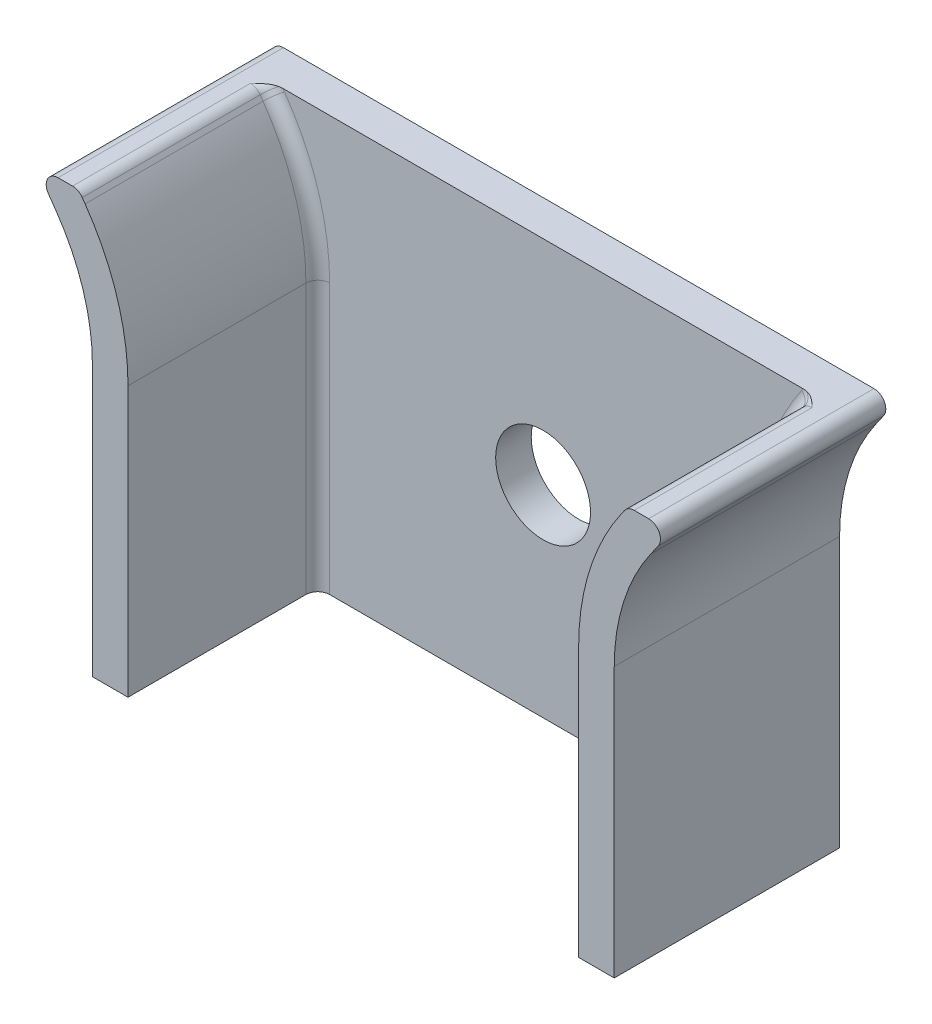
ISO-10303-21;
HEADER;
FILE_DESCRIPTION(('STEP AP214'),'2;1');
FILE_NAME('part.step','',(''),(''),'','','');
FILE_SCHEMA(('AUTOMOTIVE_DESIGN { 1 0 10303 214 1 1 1 1 }'));
ENDSEC;
DATA;
#1=APPLICATION_CONTEXT('core data for automotive mechanical design processes');
#2=APPLICATION_PROTOCOL_DEFINITION('international standard','automotive_design',2000,#1);
#3=PRODUCT_CONTEXT('',#1,'mechanical');
#4=PRODUCT('Part','Part','',(#3));
#5=PRODUCT_RELATED_PRODUCT_CATEGORY('part','',(#4));
#6=PRODUCT_DEFINITION_FORMATION('','',#4);
#7=PRODUCT_DEFINITION_CONTEXT('part definition',#1,'design');
#8=PRODUCT_DEFINITION('design','',#6,#7);
#9=PRODUCT_DEFINITION_SHAPE('','',#8);
#10=(LENGTH_UNIT() NAMED_UNIT(*) SI_UNIT(.MILLI.,.METRE.));
#11=(NAMED_UNIT(*) PLANE_ANGLE_UNIT() SI_UNIT($,.RADIAN.));
#12=(NAMED_UNIT(*) SI_UNIT($,.STERADIAN.) SOLID_ANGLE_UNIT());
#13=UNCERTAINTY_MEASURE_WITH_UNIT(LENGTH_MEASURE(1.E-05),#10,'distance_accuracy_value','');
#14=(GEOMETRIC_REPRESENTATION_CONTEXT(3) GLOBAL_UNCERTAINTY_ASSIGNED_CONTEXT((#13)) GLOBAL_UNIT_ASSIGNED_CONTEXT((#10,
#11,#12)) REPRESENTATION_CONTEXT('',''));
#15=CARTESIAN_POINT('',(0.,0.,0.));
#16=DIRECTION('',(0.,0.,1.));
#17=DIRECTION('',(1.,0.,0.));
#18=AXIS2_PLACEMENT_3D('',#15,#16,#17);
#19=CARTESIAN_POINT('',(0.,0.,3.));
#20=DIRECTION('',(0.,0.,1.));
#21=DIRECTION('',(1.,0.,0.));
#22=AXIS2_PLACEMENT_3D('',#19,#20,#21);
#23=PLANE('',#22);
#24=CARTESIAN_POINT('',(0.,17.0000000000001,3.));
#25=DIRECTION('',(0.,0.,1.));
#26=DIRECTION('',(1.,0.,0.));
#27=AXIS2_PLACEMENT_3D('',#24,#25,#26);
#28=CIRCLE('',#27,4.);
#29=CARTESIAN_POINT('',(4.,17.0000000000001,3.));
#30=VERTEX_POINT('',#29);
#31=EDGE_CURVE('E238',#30,#30,#28,.F.);
#32=ORIENTED_EDGE('',*,*,#31,.T.);
#33=EDGE_LOOP('',(#32));
#34=FACE_BOUND('',#33,.T.);
#35=CARTESIAN_POINT('',(39.,22.74812786,3.));
#36=DIRECTION('',(0.,0.,1.));
#37=DIRECTION('',(1.,0.,0.));
#38=AXIS2_PLACEMENT_3D('',#35,#36,#37);
#39=CIRCLE('',#38,21.);
#40=CARTESIAN_POINT('',(18.,22.74812786,3.));
#41=VERTEX_POINT('',#40);
#42=CARTESIAN_POINT('',(21.7978070794784,34.7932330370068,3.));
#43=VERTEX_POINT('',#42);
#44=EDGE_CURVE('E371',#41,#43,#39,.F.);
#45=ORIENTED_EDGE('',*,*,#44,.T.);
#46=DIRECTION('',(-0.573576437000323,-0.819152043834363,0.));
#47=VECTOR('',#46,1.);
#48=CARTESIAN_POINT('',(-1.72092410425407,1.20500403251831,3.));
#49=LINE('',#48,#47);
#50=CARTESIAN_POINT('',(21.9360536837472,34.990669648999,3.));
#51=VERTEX_POINT('',#50);
#52=EDGE_CURVE('E373',#43,#51,#49,.F.);
#53=ORIENTED_EDGE('',*,*,#52,.T.);
#54=DIRECTION('',(1.,0.,0.));
#55=VECTOR('',#54,1.);
#56=CARTESIAN_POINT('',(0.,34.990669648999,3.));
#57=LINE('',#56,#55);
#58=CARTESIAN_POINT('',(-21.9360536837471,34.990669648999,3.));
#59=VERTEX_POINT('',#58);
#60=EDGE_CURVE('E290',#59,#51,#57,.T.);
#61=ORIENTED_EDGE('',*,*,#60,.F.);
#62=DIRECTION('',(0.573576437000323,-0.819152043834363,0.));
#63=VECTOR('',#62,1.);
#64=CARTESIAN_POINT('',(-21.7978070794784,34.7932330370068,3.));
#65=LINE('',#64,#63);
#66=CARTESIAN_POINT('',(-21.7978070794784,34.7932330370068,3.));
#67=VERTEX_POINT('',#66);
#68=EDGE_CURVE('E367',#59,#67,#65,.T.);
#69=ORIENTED_EDGE('',*,*,#68,.T.);
#70=CARTESIAN_POINT('',(-39.,22.74812786,3.));
#71=DIRECTION('',(0.,0.,1.));
#72=DIRECTION('',(1.,0.,0.));
#73=AXIS2_PLACEMENT_3D('',#70,#71,#72);
#74=CIRCLE('',#73,21.);
#75=CARTESIAN_POINT('',(-18.,22.74812786,3.));
#76=VERTEX_POINT('',#75);
#77=EDGE_CURVE('E365',#67,#76,#74,.F.);
#78=ORIENTED_EDGE('',*,*,#77,.T.);
#79=DIRECTION('',(0.,-1.,0.));
#80=VECTOR('',#79,1.);
#81=CARTESIAN_POINT('',(-18.,0.,3.));
#82=LINE('',#81,#80);
#83=CARTESIAN_POINT('',(-18.,0.,3.));
#84=VERTEX_POINT('',#83);
#85=EDGE_CURVE('E363',#76,#84,#82,.T.);
#86=ORIENTED_EDGE('',*,*,#85,.T.);
#87=DIRECTION('',(1.,0.,0.));
#88=VECTOR('',#87,1.);
#89=CARTESIAN_POINT('',(0.,0.,3.));
#90=LINE('',#89,#88);
#91=CARTESIAN_POINT('',(18.,0.,3.));
#92=VERTEX_POINT('',#91);
#93=EDGE_CURVE('E287',#84,#92,#90,.T.);
#94=ORIENTED_EDGE('',*,*,#93,.T.);
#95=DIRECTION('',(0.,-1.,0.));
#96=VECTOR('',#95,1.);
#97=CARTESIAN_POINT('',(18.,0.,3.));
#98=LINE('',#97,#96);
#99=EDGE_CURVE('E369',#92,#41,#98,.F.);
#100=ORIENTED_EDGE('',*,*,#99,.T.);
#101=EDGE_LOOP('',(#45,#53,#61,#69,#78,#86,#94,#100));
#102=FACE_BOUND('',#101,.T.);
#103=ADVANCED_FACE('F37',(#34,#102),#23,.T.);
#104=CARTESIAN_POINT('',(0.,0.,3.));
#105=DIRECTION('',(0.,1.,0.));
#106=DIRECTION('',(0.,0.,1.));
#107=AXIS2_PLACEMENT_3D('',#104,#105,#106);
#108=PLANE('',#107);
#109=DIRECTION('',(1.,0.,0.));
#110=VECTOR('',#109,1.);
#111=CARTESIAN_POINT('',(0.,0.,0.));
#112=LINE('',#111,#110);
#113=CARTESIAN_POINT('',(-22.,0.,0.));
#114=VERTEX_POINT('',#113);
#115=CARTESIAN_POINT('',(22.,0.,0.));
#116=VERTEX_POINT('',#115);
#117=EDGE_CURVE('E286',#114,#116,#112,.T.);
#118=ORIENTED_EDGE('',*,*,#117,.T.);
#119=DIRECTION('',(0.,0.,-1.));
#120=VECTOR('',#119,1.);
#121=CARTESIAN_POINT('',(22.,0.,3.));
#122=LINE('',#121,#120);
#123=CARTESIAN_POINT('',(22.,0.,19.));
#124=VERTEX_POINT('',#123);
#125=EDGE_CURVE('E325',#124,#116,#122,.T.);
#126=ORIENTED_EDGE('',*,*,#125,.F.);
#127=DIRECTION('',(1.,0.,0.));
#128=VECTOR('',#127,1.);
#129=CARTESIAN_POINT('',(0.,0.,19.));
#130=LINE('',#129,#128);
#131=CARTESIAN_POINT('',(19.,0.,19.));
#132=VERTEX_POINT('',#131);
#133=EDGE_CURVE('E225',#132,#124,#130,.T.);
#134=ORIENTED_EDGE('',*,*,#133,.F.);
#135=DIRECTION('',(0.,0.,-1.));
#136=VECTOR('',#135,1.);
#137=CARTESIAN_POINT('',(19.,0.,19.));
#138=LINE('',#137,#136);
#139=CARTESIAN_POINT('',(19.,0.,4.));
#140=VERTEX_POINT('',#139);
#141=EDGE_CURVE('E216',#132,#140,#138,.T.);
#142=ORIENTED_EDGE('',*,*,#141,.T.);
#143=CARTESIAN_POINT('',(18.,0.,4.));
#144=DIRECTION('',(0.,1.,0.));
#145=DIRECTION('',(0.,0.,1.));
#146=AXIS2_PLACEMENT_3D('',#143,#144,#145);
#147=CIRCLE('',#146,1.);
#148=EDGE_CURVE('E46',#140,#92,#147,.T.);
#149=ORIENTED_EDGE('',*,*,#148,.T.);
#150=ORIENTED_EDGE('',*,*,#93,.F.);
#151=CARTESIAN_POINT('',(-18.,0.,4.));
#152=DIRECTION('',(0.,1.,0.));
#153=DIRECTION('',(0.,0.,1.));
#154=AXIS2_PLACEMENT_3D('',#151,#152,#153);
#155=CIRCLE('',#154,1.);
#156=CARTESIAN_POINT('',(-19.,0.,4.));
#157=VERTEX_POINT('',#156);
#158=EDGE_CURVE('E11',#84,#157,#155,.T.);
#159=ORIENTED_EDGE('',*,*,#158,.T.);
#160=DIRECTION('',(0.,0.,-1.));
#161=VECTOR('',#160,1.);
#162=CARTESIAN_POINT('',(-19.,0.,19.));
#163=LINE('',#162,#161);
#164=CARTESIAN_POINT('',(-19.,0.,19.));
#165=VERTEX_POINT('',#164);
#166=EDGE_CURVE('E277',#165,#157,#163,.T.);
#167=ORIENTED_EDGE('',*,*,#166,.F.);
#168=DIRECTION('',(1.,0.,0.));
#169=VECTOR('',#168,1.);
#170=CARTESIAN_POINT('',(0.,0.,19.));
#171=LINE('',#170,#169);
#172=CARTESIAN_POINT('',(-22.,0.,19.));
#173=VERTEX_POINT('',#172);
#174=EDGE_CURVE('E275',#173,#165,#171,.T.);
#175=ORIENTED_EDGE('',*,*,#174,.F.);
#176=DIRECTION('',(0.,0.,-1.));
#177=VECTOR('',#176,1.);
#178=CARTESIAN_POINT('',(-22.,0.,3.));
#179=LINE('',#178,#177);
#180=EDGE_CURVE('E293',#173,#114,#179,.T.);
#181=ORIENTED_EDGE('',*,*,#180,.T.);
#182=EDGE_LOOP('',(#118,#126,#134,#142,#149,#150,#159,#167,#175,#181));
#183=FACE_BOUND('',#182,.T.);
#184=ADVANCED_FACE('F439',(#183),#108,.F.);
#185=CARTESIAN_POINT('',(22.,0.,3.));
#186=DIRECTION('',(1.,0.,0.));
#187=DIRECTION('',(0.,0.,-1.));
#188=AXIS2_PLACEMENT_3D('',#185,#186,#187);
#189=PLANE('',#188);
#190=DIRECTION('',(0.,-1.,0.));
#191=VECTOR('',#190,1.);
#192=CARTESIAN_POINT('',(22.,0.,0.));
#193=LINE('',#192,#191);
#194=CARTESIAN_POINT('',(22.,22.74812786,0.));
#195=VERTEX_POINT('',#194);
#196=EDGE_CURVE('E296',#195,#116,#193,.T.);
#197=ORIENTED_EDGE('',*,*,#196,.F.);
#198=DIRECTION('',(0.,0.,-1.));
#199=VECTOR('',#198,1.);
#200=CARTESIAN_POINT('',(22.,22.74812786,3.));
#201=LINE('',#200,#199);
#202=CARTESIAN_POINT('',(22.,22.74812786,19.));
#203=VERTEX_POINT('',#202);
#204=EDGE_CURVE('E323',#203,#195,#201,.T.);
#205=ORIENTED_EDGE('',*,*,#204,.F.);
#206=DIRECTION('',(0.,1.,0.));
#207=VECTOR('',#206,1.);
#208=CARTESIAN_POINT('',(22.,0.,19.));
#209=LINE('',#208,#207);
#210=EDGE_CURVE('E242',#124,#203,#209,.T.);
#211=ORIENTED_EDGE('',*,*,#210,.F.);
#212=ORIENTED_EDGE('',*,*,#125,.T.);
#213=EDGE_LOOP('',(#197,#205,#211,#212));
#214=FACE_BOUND('',#213,.T.);
#215=ADVANCED_FACE('F447',(#214),#189,.T.);
#216=CARTESIAN_POINT('',(39.,22.74812786,3.));
#217=DIRECTION('',(0.,0.,-1.));
#218=DIRECTION('',(-1.,0.,0.));
#219=AXIS2_PLACEMENT_3D('',#216,#217,#218);
#220=CYLINDRICAL_SURFACE('',#219,17.);
#221=CARTESIAN_POINT('',(39.,22.74812786,0.));
#222=DIRECTION('',(0.,0.,1.));
#223=DIRECTION('',(1.,0.,0.));
#224=AXIS2_PLACEMENT_3D('',#221,#222,#223);
#225=CIRCLE('',#224,17.);
#226=CARTESIAN_POINT('',(25.0744152548158,32.4989272890055,0.));
#227=VERTEX_POINT('',#226);
#228=EDGE_CURVE('E299',#195,#227,#225,.F.);
#229=ORIENTED_EDGE('',*,*,#228,.T.);
#230=DIRECTION('',(0.,0.,-1.));
#231=VECTOR('',#230,1.);
#232=CARTESIAN_POINT('',(25.0744152548158,32.4989272890055,3.));
#233=LINE('',#232,#231);
#234=CARTESIAN_POINT('',(25.0744152548158,32.4989272890055,19.));
#235=VERTEX_POINT('',#234);
#236=EDGE_CURVE('E320',#235,#227,#233,.T.);
#237=ORIENTED_EDGE('',*,*,#236,.F.);
#238=CARTESIAN_POINT('',(39.,22.74812786,19.));
#239=DIRECTION('',(0.,0.,1.));
#240=DIRECTION('',(1.,0.,0.));
#241=AXIS2_PLACEMENT_3D('',#238,#239,#240);
#242=CIRCLE('',#241,17.);
#243=EDGE_CURVE('E245',#203,#235,#242,.F.);
#244=ORIENTED_EDGE('',*,*,#243,.F.);
#245=ORIENTED_EDGE('',*,*,#204,.T.);
#246=EDGE_LOOP('',(#229,#237,#244,#245));
#247=FACE_BOUND('',#246,.T.);
#248=ADVANCED_FACE('F504',(#247),#220,.F.);
#249=CARTESIAN_POINT('',(1.55568407108338,-1.08930171548298,3.));
#250=DIRECTION('',(0.819152043834363,-0.573576437000323,0.));
#251=DIRECTION('',(0.573576437000323,0.819152043834363,0.));
#252=AXIS2_PLACEMENT_3D('',#249,#250,#251);
#253=PLANE('',#252);
#254=DIRECTION('',(-0.573576437000323,-0.819152043834363,0.));
#255=VECTOR('',#254,1.);
#256=CARTESIAN_POINT('',(1.55568407108338,-1.08930171548298,0.));
#257=LINE('',#256,#255);
#258=CARTESIAN_POINT('',(25.7173219565075,33.4170932119987,0.));
#259=VERTEX_POINT('',#258);
#260=EDGE_CURVE('E302',#259,#227,#257,.T.);
#261=ORIENTED_EDGE('',*,*,#260,.F.);
#262=DIRECTION('',(0.,0.,-1.));
#263=VECTOR('',#262,1.);
#264=CARTESIAN_POINT('',(25.7173219565075,33.4170932119987,3.));
#265=LINE('',#264,#263);
#266=CARTESIAN_POINT('',(25.7173219565075,33.4170932119987,19.));
#267=VERTEX_POINT('',#266);
#268=EDGE_CURVE('E353',#259,#267,#265,.F.);
#269=ORIENTED_EDGE('',*,*,#268,.T.);
#270=DIRECTION('',(0.573576437000323,0.819152043834363,0.));
#271=VECTOR('',#270,1.);
#272=CARTESIAN_POINT('',(1.55568407108338,-1.08930171548298,19.));
#273=LINE('',#272,#271);
#274=EDGE_CURVE('E248',#235,#267,#273,.T.);
#275=ORIENTED_EDGE('',*,*,#274,.F.);
#276=ORIENTED_EDGE('',*,*,#236,.T.);
#277=EDGE_LOOP('',(#261,#269,#275,#276));
#278=FACE_BOUND('',#277,.T.);
#279=ADVANCED_FACE('F406',(#278),#253,.T.);
#280=CARTESIAN_POINT('',(0.,34.990669648999,3.));
#281=DIRECTION('',(0.,1.,0.));
#282=DIRECTION('',(0.,0.,1.));
#283=AXIS2_PLACEMENT_3D('',#280,#281,#282);
#284=PLANE('',#283);
#285=ORIENTED_EDGE('',*,*,#60,.T.);
#286=CARTESIAN_POINT('',(21.9360536837472,34.990669648999,4.));
#287=DIRECTION('',(0.,1.,0.));
#288=DIRECTION('',(-1.,0.,0.));
#289=AXIS2_PLACEMENT_3D('',#286,#287,#288);
#290=ELLIPSE('',#289,1.22077458943898,1.);
#291=CARTESIAN_POINT('',(22.2492473189013,34.990669648999,3.0334698906344));
#292=VERTEX_POINT('',#291);
#293=EDGE_CURVE('E61',#51,#292,#290,.F.);
#294=ORIENTED_EDGE('',*,*,#293,.T.);
#295=CARTESIAN_POINT('',(22.2492473189013,34.990669648999,3.0334698906344));
#296=CARTESIAN_POINT('',(22.3327137658806,34.990669648999,3.05159021641889));
#297=CARTESIAN_POINT('',(22.4143371279731,34.990669648999,3.07658895860684));
#298=CARTESIAN_POINT('',(22.5720229846735,34.990669648999,3.13739709967167));
#299=CARTESIAN_POINT('',(22.6481529837455,34.990669648999,3.17302937471534));
#300=CARTESIAN_POINT('',(22.8120480293901,34.990669648999,3.26176400213126));
#301=CARTESIAN_POINT('',(22.8986374895244,34.990669648999,3.3169890963061));
#302=CARTESIAN_POINT('',(23.0654375313906,34.990669648999,3.43645559774857));
#303=CARTESIAN_POINT('',(23.1456356661031,34.990669648999,3.50071395576616));
#304=CARTESIAN_POINT('',(23.3800282268812,34.990669648999,3.70286424313476));
#305=CARTESIAN_POINT('',(23.5266509744961,34.990669648999,3.84925798489561));
#306=CARTESIAN_POINT('',(23.6744139248016,34.990669648999,3.99701860036995));
#307=CARTESIAN_POINT('',(23.6759046370927,34.990669648999,3.99850931265191));
#308=CARTESIAN_POINT('',(23.6773953232342,34.990669648999,4.));
#309=B_SPLINE_CURVE_WITH_KNOTS('',3,(#295,#296,#297,#298,#299,#300,#301,#302,#303,#304,#305,
#306,#307,#308),.UNSPECIFIED.,.F.,.F.,(4,2,2,2,2,2,4),(0.,0.255443374901723,0.50684909804806,
0.814141399553203,1.12201822353163,1.74258333272078,1.74890788804166),.UNSPECIFIED.);
#310=CARTESIAN_POINT('',(23.6773953232342,34.990669648999,4.));
#311=VERTEX_POINT('',#310);
#312=EDGE_CURVE('E387',#292,#311,#309,.T.);
#313=ORIENTED_EDGE('',*,*,#312,.T.);
#314=DIRECTION('',(0.,0.,-1.));
#315=VECTOR('',#314,1.);
#316=CARTESIAN_POINT('',(23.6773953232342,34.990669648999,19.));
#317=LINE('',#316,#315);
#318=CARTESIAN_POINT('',(23.6773953232342,34.990669648999,19.));
#319=VERTEX_POINT('',#318);
#320=EDGE_CURVE('E337',#311,#319,#317,.F.);
#321=ORIENTED_EDGE('',*,*,#320,.T.);
#322=DIRECTION('',(-1.,0.,0.));
#323=VECTOR('',#322,1.);
#324=CARTESIAN_POINT('',(0.,34.990669648999,19.));
#325=LINE('',#324,#323);
#326=CARTESIAN_POINT('',(24.8981699126732,34.990669648999,19.));
#327=VERTEX_POINT('',#326);
#328=EDGE_CURVE('E251',#327,#319,#325,.T.);
#329=ORIENTED_EDGE('',*,*,#328,.F.);
#330=DIRECTION('',(0.,0.,-1.));
#331=VECTOR('',#330,1.);
#332=CARTESIAN_POINT('',(24.8981699126732,34.990669648999,3.));
#333=LINE('',#332,#331);
#334=CARTESIAN_POINT('',(24.8981699126732,34.990669648999,0.));
#335=VERTEX_POINT('',#334);
#336=EDGE_CURVE('E332',#327,#335,#333,.T.);
#337=ORIENTED_EDGE('',*,*,#336,.T.);
#338=DIRECTION('',(1.,0.,0.));
#339=VECTOR('',#338,1.);
#340=CARTESIAN_POINT('',(0.,34.990669648999,0.));
#341=LINE('',#340,#339);
#342=CARTESIAN_POINT('',(-24.8981699126732,34.990669648999,0.));
#343=VERTEX_POINT('',#342);
#344=EDGE_CURVE('E304',#343,#335,#341,.T.);
#345=ORIENTED_EDGE('',*,*,#344,.F.);
#346=DIRECTION('',(0.,0.,-1.));
#347=VECTOR('',#346,1.);
#348=CARTESIAN_POINT('',(-24.8981699126732,34.990669648999,19.));
#349=LINE('',#348,#347);
#350=CARTESIAN_POINT('',(-24.8981699126732,34.990669648999,19.));
#351=VERTEX_POINT('',#350);
#352=EDGE_CURVE('E330',#343,#351,#349,.F.);
#353=ORIENTED_EDGE('',*,*,#352,.T.);
#354=DIRECTION('',(-1.,0.,0.));
#355=VECTOR('',#354,1.);
#356=CARTESIAN_POINT('',(0.,34.990669648999,19.));
#357=LINE('',#356,#355);
#358=CARTESIAN_POINT('',(-23.6773953232342,34.990669648999,19.));
#359=VERTEX_POINT('',#358);
#360=EDGE_CURVE('E264',#359,#351,#357,.T.);
#361=ORIENTED_EDGE('',*,*,#360,.F.);
#362=DIRECTION('',(0.,0.,-1.));
#363=VECTOR('',#362,1.);
#364=CARTESIAN_POINT('',(-23.6773953232342,34.990669648999,3.));
#365=LINE('',#364,#363);
#366=CARTESIAN_POINT('',(-23.6773953232342,34.990669648999,4.));
#367=VERTEX_POINT('',#366);
#368=EDGE_CURVE('E335',#359,#367,#365,.T.);
#369=ORIENTED_EDGE('',*,*,#368,.T.);
#370=CARTESIAN_POINT('',(-22.2492473189013,34.990669648999,3.0334698906344));
#371=CARTESIAN_POINT('',(-22.3327137658805,34.990669648999,3.05159021641889));
#372=CARTESIAN_POINT('',(-22.4143371279731,34.990669648999,3.07658895860684));
#373=CARTESIAN_POINT('',(-22.5720229846735,34.990669648999,3.13739709967168));
#374=CARTESIAN_POINT('',(-22.6481529837455,34.990669648999,3.17302937471534));
#375=CARTESIAN_POINT('',(-22.8120480293901,34.990669648999,3.26176400213126));
#376=CARTESIAN_POINT('',(-22.8986374895243,34.990669648999,3.3169890963061));
#377=CARTESIAN_POINT('',(-23.0654375313906,34.990669648999,3.43645559774856));
#378=CARTESIAN_POINT('',(-23.1456356661031,34.990669648999,3.50071395576615));
#379=CARTESIAN_POINT('',(-23.3800282268812,34.990669648999,3.70286424313477));
#380=CARTESIAN_POINT('',(-23.5266509744959,34.990669648999,3.84925798489574));
#381=CARTESIAN_POINT('',(-23.6744139248016,34.990669648999,3.99701860036996));
#382=CARTESIAN_POINT('',(-23.6759046370927,34.990669648999,3.99850931265191));
#383=CARTESIAN_POINT('',(-23.6773953232342,34.990669648999,4.));
#384=B_SPLINE_CURVE_WITH_KNOTS('',3,(#370,#371,#372,#373,#374,#375,#376,#377,#378,#379,#380,
#381,#382,#383),.UNSPECIFIED.,.F.,.F.,(4,2,2,2,2,2,4),(0.,0.255443374901738,0.506849098048059,
0.814141399553202,1.12201822353162,1.74258333272079,1.74890788804166),.UNSPECIFIED.);
#385=CARTESIAN_POINT('',(-22.2492473189013,34.990669648999,3.0334698906344));
#386=VERTEX_POINT('',#385);
#387=EDGE_CURVE('E54',#367,#386,#384,.F.);
#388=ORIENTED_EDGE('',*,*,#387,.T.);
#389=CARTESIAN_POINT('',(-21.9360536837472,34.990669648999,4.));
#390=DIRECTION('',(0.,1.,0.));
#391=DIRECTION('',(-1.,0.,0.));
#392=AXIS2_PLACEMENT_3D('',#389,#390,#391);
#393=ELLIPSE('',#392,1.22077458943898,1.);
#394=EDGE_CURVE('E416',#386,#59,#393,.F.);
#395=ORIENTED_EDGE('',*,*,#394,.T.);
#396=EDGE_LOOP('',(#285,#294,#313,#321,#329,#337,#345,#353,#361,#369,#388,#395));
#397=FACE_BOUND('',#396,.T.);
#398=ADVANCED_FACE('F400',(#397),#284,.T.);
#399=CARTESIAN_POINT('',(-1.55568407108338,-1.08930171548298,3.));
#400=DIRECTION('',(0.819152043834363,0.573576437000323,0.));
#401=DIRECTION('',(-0.573576437000323,0.819152043834363,0.));
#402=AXIS2_PLACEMENT_3D('',#399,#400,#401);
#403=PLANE('',#402);
#404=DIRECTION('',(0.573576437000323,-0.819152043834363,0.));
#405=VECTOR('',#404,1.);
#406=CARTESIAN_POINT('',(-1.55568407108338,-1.08930171548298,19.));
#407=LINE('',#406,#405);
#408=CARTESIAN_POINT('',(-25.7173219565075,33.4170932119987,19.));
#409=VERTEX_POINT('',#408);
#410=CARTESIAN_POINT('',(-25.0744152548158,32.4989272890055,19.));
#411=VERTEX_POINT('',#410);
#412=EDGE_CURVE('E267',#409,#411,#407,.T.);
#413=ORIENTED_EDGE('',*,*,#412,.F.);
#414=DIRECTION('',(0.,0.,-1.));
#415=VECTOR('',#414,1.);
#416=CARTESIAN_POINT('',(-25.7173219565075,33.4170932119987,0.));
#417=LINE('',#416,#415);
#418=CARTESIAN_POINT('',(-25.7173219565075,33.4170932119987,0.));
#419=VERTEX_POINT('',#418);
#420=EDGE_CURVE('E355',#409,#419,#417,.T.);
#421=ORIENTED_EDGE('',*,*,#420,.T.);
#422=DIRECTION('',(0.573576437000323,-0.819152043834363,0.));
#423=VECTOR('',#422,1.);
#424=CARTESIAN_POINT('',(-1.55568407108338,-1.08930171548298,0.));
#425=LINE('',#424,#423);
#426=CARTESIAN_POINT('',(-25.0744152548158,32.4989272890055,0.));
#427=VERTEX_POINT('',#426);
#428=EDGE_CURVE('E307',#419,#427,#425,.T.);
#429=ORIENTED_EDGE('',*,*,#428,.T.);
#430=DIRECTION('',(0.,0.,-1.));
#431=VECTOR('',#430,1.);
#432=CARTESIAN_POINT('',(-25.0744152548158,32.4989272890055,3.));
#433=LINE('',#432,#431);
#434=EDGE_CURVE('E317',#411,#427,#433,.T.);
#435=ORIENTED_EDGE('',*,*,#434,.F.);
#436=EDGE_LOOP('',(#413,#421,#429,#435));
#437=FACE_BOUND('',#436,.T.);
#438=ADVANCED_FACE('F405',(#437),#403,.F.);
#439=CARTESIAN_POINT('',(-39.,22.74812786,3.));
#440=DIRECTION('',(0.,0.,-1.));
#441=DIRECTION('',(-1.,0.,0.));
#442=AXIS2_PLACEMENT_3D('',#439,#440,#441);
#443=CYLINDRICAL_SURFACE('',#442,17.);
#444=CARTESIAN_POINT('',(-39.,22.74812786,0.));
#445=DIRECTION('',(0.,0.,1.));
#446=DIRECTION('',(1.,0.,0.));
#447=AXIS2_PLACEMENT_3D('',#444,#445,#446);
#448=CIRCLE('',#447,17.);
#449=CARTESIAN_POINT('',(-22.,22.74812786,0.));
#450=VERTEX_POINT('',#449);
#451=EDGE_CURVE('E309',#450,#427,#448,.T.);
#452=ORIENTED_EDGE('',*,*,#451,.F.);
#453=DIRECTION('',(0.,0.,-1.));
#454=VECTOR('',#453,1.);
#455=CARTESIAN_POINT('',(-22.,22.74812786,3.));
#456=LINE('',#455,#454);
#457=CARTESIAN_POINT('',(-22.,22.74812786,19.));
#458=VERTEX_POINT('',#457);
#459=EDGE_CURVE('E315',#458,#450,#456,.T.);
#460=ORIENTED_EDGE('',*,*,#459,.F.);
#461=CARTESIAN_POINT('',(-39.,22.74812786,19.));
#462=DIRECTION('',(0.,0.,1.));
#463=DIRECTION('',(1.,0.,0.));
#464=AXIS2_PLACEMENT_3D('',#461,#462,#463);
#465=CIRCLE('',#464,17.);
#466=EDGE_CURVE('E269',#411,#458,#465,.F.);
#467=ORIENTED_EDGE('',*,*,#466,.F.);
#468=ORIENTED_EDGE('',*,*,#434,.T.);
#469=EDGE_LOOP('',(#452,#460,#467,#468));
#470=FACE_BOUND('',#469,.T.);
#471=ADVANCED_FACE('F461',(#470),#443,.F.);
#472=CARTESIAN_POINT('',(-22.,0.,3.));
#473=DIRECTION('',(1.,0.,0.));
#474=DIRECTION('',(0.,0.,-1.));
#475=AXIS2_PLACEMENT_3D('',#472,#473,#474);
#476=PLANE('',#475);
#477=DIRECTION('',(0.,-1.,0.));
#478=VECTOR('',#477,1.);
#479=CARTESIAN_POINT('',(-22.,0.,0.));
#480=LINE('',#479,#478);
#481=EDGE_CURVE('E291',#450,#114,#480,.T.);
#482=ORIENTED_EDGE('',*,*,#481,.T.);
#483=ORIENTED_EDGE('',*,*,#180,.F.);
#484=DIRECTION('',(0.,-1.,0.));
#485=VECTOR('',#484,1.);
#486=CARTESIAN_POINT('',(-22.,0.,19.));
#487=LINE('',#486,#485);
#488=EDGE_CURVE('E272',#458,#173,#487,.T.);
#489=ORIENTED_EDGE('',*,*,#488,.F.);
#490=ORIENTED_EDGE('',*,*,#459,.T.);
#491=EDGE_LOOP('',(#482,#483,#489,#490));
#492=FACE_BOUND('',#491,.T.);
#493=ADVANCED_FACE('F458',(#492),#476,.F.);
#494=CARTESIAN_POINT('',(0.,0.,0.));
#495=DIRECTION('',(0.,0.,1.));
#496=DIRECTION('',(1.,0.,0.));
#497=AXIS2_PLACEMENT_3D('',#494,#495,#496);
#498=PLANE('',#497);
#499=CARTESIAN_POINT('',(0.,17.0000000000001,0.));
#500=DIRECTION('',(0.,0.,-1.));
#501=DIRECTION('',(-1.,0.,0.));
#502=AXIS2_PLACEMENT_3D('',#499,#500,#501);
#503=CIRCLE('',#502,4.);
#504=CARTESIAN_POINT('',(-4.,17.0000000000001,0.));
#505=VERTEX_POINT('',#504);
#506=EDGE_CURVE('E868',#505,#505,#503,.T.);
#507=ORIENTED_EDGE('',*,*,#506,.F.);
#508=EDGE_LOOP('',(#507));
#509=FACE_BOUND('',#508,.T.);
#510=ORIENTED_EDGE('',*,*,#344,.T.);
#511=CARTESIAN_POINT('',(24.8981699126732,33.990669648999,0.));
#512=DIRECTION('',(0.,0.,1.));
#513=DIRECTION('',(1.,0.,0.));
#514=AXIS2_PLACEMENT_3D('',#511,#512,#513);
#515=CIRCLE('',#514,1.);
#516=EDGE_CURVE('E351',#335,#259,#515,.F.);
#517=ORIENTED_EDGE('',*,*,#516,.T.);
#518=ORIENTED_EDGE('',*,*,#260,.T.);
#519=ORIENTED_EDGE('',*,*,#228,.F.);
#520=ORIENTED_EDGE('',*,*,#196,.T.);
#521=ORIENTED_EDGE('',*,*,#117,.F.);
#522=ORIENTED_EDGE('',*,*,#481,.F.);
#523=ORIENTED_EDGE('',*,*,#451,.T.);
#524=ORIENTED_EDGE('',*,*,#428,.F.);
#525=CARTESIAN_POINT('',(-24.8981699126732,33.990669648999,0.));
#526=DIRECTION('',(0.,0.,1.));
#527=DIRECTION('',(1.,0.,0.));
#528=AXIS2_PLACEMENT_3D('',#525,#526,#527);
#529=CIRCLE('',#528,1.);
#530=EDGE_CURVE('E349',#419,#343,#529,.F.);
#531=ORIENTED_EDGE('',*,*,#530,.T.);
#532=EDGE_LOOP('',(#510,#517,#518,#519,#520,#521,#522,#523,#524,#531));
#533=FACE_BOUND('',#532,.T.);
#534=ADVANCED_FACE('F456',(#509,#533),#498,.F.);
#535=CARTESIAN_POINT('',(-19.,0.,19.));
#536=DIRECTION('',(1.,0.,0.));
#537=DIRECTION('',(0.,0.,-1.));
#538=AXIS2_PLACEMENT_3D('',#535,#536,#537);
#539=PLANE('',#538);
#540=ORIENTED_EDGE('',*,*,#166,.T.);
#541=DIRECTION('',(0.,-1.,0.));
#542=VECTOR('',#541,1.);
#543=CARTESIAN_POINT('',(-19.,22.74812786,4.));
#544=LINE('',#543,#542);
#545=CARTESIAN_POINT('',(-19.,22.74812786,4.));
#546=VERTEX_POINT('',#545);
#547=EDGE_CURVE('E385',#157,#546,#544,.F.);
#548=ORIENTED_EDGE('',*,*,#547,.T.);
#549=DIRECTION('',(0.,0.,-1.));
#550=VECTOR('',#549,1.);
#551=CARTESIAN_POINT('',(-19.,22.74812786,19.));
#552=LINE('',#551,#550);
#553=CARTESIAN_POINT('',(-19.,22.74812786,19.));
#554=VERTEX_POINT('',#553);
#555=EDGE_CURVE('E283',#554,#546,#552,.T.);
#556=ORIENTED_EDGE('',*,*,#555,.F.);
#557=DIRECTION('',(0.,-1.,0.));
#558=VECTOR('',#557,1.);
#559=CARTESIAN_POINT('',(-19.,0.,19.));
#560=LINE('',#559,#558);
#561=EDGE_CURVE('E215',#554,#165,#560,.T.);
#562=ORIENTED_EDGE('',*,*,#561,.T.);
#563=EDGE_LOOP('',(#540,#548,#556,#562));
#564=FACE_BOUND('',#563,.T.);
#565=ADVANCED_FACE('F454',(#564),#539,.T.);
#566=CARTESIAN_POINT('',(-39.,22.74812786,19.));
#567=DIRECTION('',(0.,0.,-1.));
#568=DIRECTION('',(-1.,0.,0.));
#569=AXIS2_PLACEMENT_3D('',#566,#567,#568);
#570=CYLINDRICAL_SURFACE('',#569,20.);
#571=ORIENTED_EDGE('',*,*,#555,.T.);
#572=CARTESIAN_POINT('',(-39.,22.74812786,4.));
#573=DIRECTION('',(0.,0.,1.));
#574=DIRECTION('',(1.,0.,0.));
#575=AXIS2_PLACEMENT_3D('',#572,#573,#574);
#576=CIRCLE('',#575,20.);
#577=CARTESIAN_POINT('',(-22.6169591233127,34.2196566000065,4.));
#578=VERTEX_POINT('',#577);
#579=EDGE_CURVE('E381',#546,#578,#576,.T.);
#580=ORIENTED_EDGE('',*,*,#579,.T.);
#581=DIRECTION('',(0.,0.,-1.));
#582=VECTOR('',#581,1.);
#583=CARTESIAN_POINT('',(-22.6169591233127,34.2196566000065,19.));
#584=LINE('',#583,#582);
#585=CARTESIAN_POINT('',(-22.6169591233127,34.2196566000065,19.));
#586=VERTEX_POINT('',#585);
#587=EDGE_CURVE('E280',#586,#578,#584,.T.);
#588=ORIENTED_EDGE('',*,*,#587,.F.);
#589=CARTESIAN_POINT('',(-39.,22.74812786,19.));
#590=DIRECTION('',(0.,0.,1.));
#591=DIRECTION('',(1.,0.,0.));
#592=AXIS2_PLACEMENT_3D('',#589,#590,#591);
#593=CIRCLE('',#592,20.);
#594=EDGE_CURVE('E259',#554,#586,#593,.T.);
#595=ORIENTED_EDGE('',*,*,#594,.F.);
#596=EDGE_LOOP('',(#571,#580,#588,#595));
#597=FACE_BOUND('',#596,.T.);
#598=ADVANCED_FACE('F620',(#597),#570,.T.);
#599=CARTESIAN_POINT('',(0.901772060419702,0.631427595517982,19.));
#600=DIRECTION('',(0.819152043834363,0.573576437000323,0.));
#601=DIRECTION('',(-0.573576437000323,0.819152043834363,0.));
#602=AXIS2_PLACEMENT_3D('',#599,#600,#601);
#603=PLANE('',#602);
#604=ORIENTED_EDGE('',*,*,#587,.T.);
#605=DIRECTION('',(0.573576437000323,-0.819152043834363,0.));
#606=VECTOR('',#605,1.);
#607=CARTESIAN_POINT('',(-22.8582432793998,34.5642460859993,4.));
#608=LINE('',#607,#606);
#609=CARTESIAN_POINT('',(-22.8582432793998,34.5642460859993,4.));
#610=VERTEX_POINT('',#609);
#611=EDGE_CURVE('E379',#578,#610,#608,.F.);
#612=ORIENTED_EDGE('',*,*,#611,.T.);
#613=DIRECTION('',(0.,0.,-1.));
#614=VECTOR('',#613,1.);
#615=CARTESIAN_POINT('',(-22.8582432793998,34.5642460859993,19.));
#616=LINE('',#615,#614);
#617=CARTESIAN_POINT('',(-22.8582432793998,34.5642460859993,19.));
#618=VERTEX_POINT('',#617);
#619=EDGE_CURVE('E343',#610,#618,#616,.F.);
#620=ORIENTED_EDGE('',*,*,#619,.T.);
#621=DIRECTION('',(0.573576437000323,-0.819152043834363,0.));
#622=VECTOR('',#621,1.);
#623=CARTESIAN_POINT('',(0.901772060419702,0.631427595517982,19.));
#624=LINE('',#623,#622);
#625=EDGE_CURVE('E262',#618,#586,#624,.T.);
#626=ORIENTED_EDGE('',*,*,#625,.T.);
#627=EDGE_LOOP('',(#604,#612,#620,#626));
#628=FACE_BOUND('',#627,.T.);
#629=ADVANCED_FACE('F585',(#628),#603,.T.);
#630=CARTESIAN_POINT('',(0.,0.,19.));
#631=DIRECTION('',(0.,0.,1.));
#632=DIRECTION('',(1.,0.,0.));
#633=AXIS2_PLACEMENT_3D('',#630,#631,#632);
#634=PLANE('',#633);
#635=ORIENTED_EDGE('',*,*,#625,.F.);
#636=CARTESIAN_POINT('',(-23.6773953232342,33.990669648999,19.));
#637=DIRECTION('',(0.,0.,1.));
#638=DIRECTION('',(1.,0.,0.));
#639=AXIS2_PLACEMENT_3D('',#636,#637,#638);
#640=CIRCLE('',#639,1.);
#641=EDGE_CURVE('E347',#618,#359,#640,.T.);
#642=ORIENTED_EDGE('',*,*,#641,.T.);
#643=ORIENTED_EDGE('',*,*,#360,.T.);
#644=CARTESIAN_POINT('',(-24.8981699126732,33.990669648999,19.));
#645=DIRECTION('',(0.,0.,1.));
#646=DIRECTION('',(1.,0.,0.));
#647=AXIS2_PLACEMENT_3D('',#644,#645,#646);
#648=CIRCLE('',#647,1.);
#649=EDGE_CURVE('E345',#351,#409,#648,.T.);
#650=ORIENTED_EDGE('',*,*,#649,.T.);
#651=ORIENTED_EDGE('',*,*,#412,.T.);
#652=ORIENTED_EDGE('',*,*,#466,.T.);
#653=ORIENTED_EDGE('',*,*,#488,.T.);
#654=ORIENTED_EDGE('',*,*,#174,.T.);
#655=ORIENTED_EDGE('',*,*,#561,.F.);
#656=ORIENTED_EDGE('',*,*,#594,.T.);
#657=EDGE_LOOP('',(#635,#642,#643,#650,#651,#652,#653,#654,#655,#656));
#658=FACE_BOUND('',#657,.T.);
#659=ADVANCED_FACE('F483',(#658),#634,.T.);
#660=CARTESIAN_POINT('',(39.,22.74812786,19.));
#661=DIRECTION('',(0.,0.,-1.));
#662=DIRECTION('',(-1.,0.,0.));
#663=AXIS2_PLACEMENT_3D('',#660,#661,#662);
#664=CYLINDRICAL_SURFACE('',#663,20.);
#665=DIRECTION('',(0.,0.,-1.));
#666=VECTOR('',#665,1.);
#667=CARTESIAN_POINT('',(22.6169591233127,34.2196566000065,19.));
#668=LINE('',#667,#666);
#669=CARTESIAN_POINT('',(22.6169591233127,34.2196566000065,19.));
#670=VERTEX_POINT('',#669);
#671=CARTESIAN_POINT('',(22.6169591233127,34.2196566000065,4.));
#672=VERTEX_POINT('',#671);
#673=EDGE_CURVE('E254',#670,#672,#668,.T.);
#674=ORIENTED_EDGE('',*,*,#673,.T.);
#675=CARTESIAN_POINT('',(39.,22.74812786,4.));
#676=DIRECTION('',(0.,0.,1.));
#677=DIRECTION('',(1.,0.,0.));
#678=AXIS2_PLACEMENT_3D('',#675,#676,#677);
#679=CIRCLE('',#678,20.);
#680=CARTESIAN_POINT('',(19.,22.74812786,4.));
#681=VERTEX_POINT('',#680);
#682=EDGE_CURVE('E212',#672,#681,#679,.T.);
#683=ORIENTED_EDGE('',*,*,#682,.T.);
#684=DIRECTION('',(0.,0.,-1.));
#685=VECTOR('',#684,1.);
#686=CARTESIAN_POINT('',(19.,22.74812786,19.));
#687=LINE('',#686,#685);
#688=CARTESIAN_POINT('',(19.,22.74812786,19.));
#689=VERTEX_POINT('',#688);
#690=EDGE_CURVE('E205',#689,#681,#687,.T.);
#691=ORIENTED_EDGE('',*,*,#690,.F.);
#692=CARTESIAN_POINT('',(39.,22.74812786,19.));
#693=DIRECTION('',(0.,0.,1.));
#694=DIRECTION('',(1.,0.,0.));
#695=AXIS2_PLACEMENT_3D('',#692,#693,#694);
#696=CIRCLE('',#695,20.);
#697=EDGE_CURVE('E210',#689,#670,#696,.F.);
#698=ORIENTED_EDGE('',*,*,#697,.T.);
#699=EDGE_LOOP('',(#674,#683,#691,#698));
#700=FACE_BOUND('',#699,.T.);
#701=ADVANCED_FACE('F208',(#700),#664,.T.);
#702=CARTESIAN_POINT('',(19.,0.,19.));
#703=DIRECTION('',(1.,0.,0.));
#704=DIRECTION('',(0.,0.,-1.));
#705=AXIS2_PLACEMENT_3D('',#702,#703,#704);
#706=PLANE('',#705);
#707=ORIENTED_EDGE('',*,*,#690,.T.);
#708=DIRECTION('',(0.,-1.,0.));
#709=VECTOR('',#708,1.);
#710=CARTESIAN_POINT('',(19.,0.,4.));
#711=LINE('',#710,#709);
#712=EDGE_CURVE('E383',#681,#140,#711,.T.);
#713=ORIENTED_EDGE('',*,*,#712,.T.);
#714=ORIENTED_EDGE('',*,*,#141,.F.);
#715=DIRECTION('',(0.,-1.,0.));
#716=VECTOR('',#715,1.);
#717=CARTESIAN_POINT('',(19.,0.,19.));
#718=LINE('',#717,#716);
#719=EDGE_CURVE('E219',#689,#132,#718,.T.);
#720=ORIENTED_EDGE('',*,*,#719,.F.);
#721=EDGE_LOOP('',(#707,#713,#714,#720));
#722=FACE_BOUND('',#721,.T.);
#723=ADVANCED_FACE('F220',(#722),#706,.F.);
#724=CARTESIAN_POINT('',(-0.901772060419702,0.631427595517982,19.));
#725=DIRECTION('',(0.819152043834363,-0.573576437000323,0.));
#726=DIRECTION('',(0.573576437000323,0.819152043834363,0.));
#727=AXIS2_PLACEMENT_3D('',#724,#725,#726);
#728=PLANE('',#727);
#729=DIRECTION('',(0.,0.,-1.));
#730=VECTOR('',#729,1.);
#731=CARTESIAN_POINT('',(22.8582432793998,34.5642460859994,3.));
#732=LINE('',#731,#730);
#733=CARTESIAN_POINT('',(22.8582432793998,34.5642460859993,19.));
#734=VERTEX_POINT('',#733);
#735=CARTESIAN_POINT('',(22.8582432793998,34.5642460859994,4.));
#736=VERTEX_POINT('',#735);
#737=EDGE_CURVE('E327',#734,#736,#732,.T.);
#738=ORIENTED_EDGE('',*,*,#737,.T.);
#739=DIRECTION('',(-0.573576437000323,-0.819152043834363,0.));
#740=VECTOR('',#739,1.);
#741=CARTESIAN_POINT('',(-0.901772060419702,0.631427595517982,4.));
#742=LINE('',#741,#740);
#743=EDGE_CURVE('E361',#736,#672,#742,.T.);
#744=ORIENTED_EDGE('',*,*,#743,.T.);
#745=ORIENTED_EDGE('',*,*,#673,.F.);
#746=DIRECTION('',(-0.573576437000323,-0.819152043834363,0.));
#747=VECTOR('',#746,1.);
#748=CARTESIAN_POINT('',(-0.901772060419702,0.631427595517982,19.));
#749=LINE('',#748,#747);
#750=EDGE_CURVE('E230',#734,#670,#749,.T.);
#751=ORIENTED_EDGE('',*,*,#750,.F.);
#752=EDGE_LOOP('',(#738,#744,#745,#751));
#753=FACE_BOUND('',#752,.T.);
#754=ADVANCED_FACE('F515',(#753),#728,.F.);
#755=CARTESIAN_POINT('',(0.,0.,19.));
#756=DIRECTION('',(0.,0.,1.));
#757=DIRECTION('',(1.,0.,0.));
#758=AXIS2_PLACEMENT_3D('',#755,#756,#757);
#759=PLANE('',#758);
#760=ORIENTED_EDGE('',*,*,#328,.T.);
#761=CARTESIAN_POINT('',(23.6773953232342,33.990669648999,19.));
#762=DIRECTION('',(0.,0.,1.));
#763=DIRECTION('',(1.,0.,0.));
#764=AXIS2_PLACEMENT_3D('',#761,#762,#763);
#765=CIRCLE('',#764,1.);
#766=EDGE_CURVE('E341',#319,#734,#765,.T.);
#767=ORIENTED_EDGE('',*,*,#766,.T.);
#768=ORIENTED_EDGE('',*,*,#750,.T.);
#769=ORIENTED_EDGE('',*,*,#697,.F.);
#770=ORIENTED_EDGE('',*,*,#719,.T.);
#771=ORIENTED_EDGE('',*,*,#133,.T.);
#772=ORIENTED_EDGE('',*,*,#210,.T.);
#773=ORIENTED_EDGE('',*,*,#243,.T.);
#774=ORIENTED_EDGE('',*,*,#274,.T.);
#775=CARTESIAN_POINT('',(24.8981699126732,33.990669648999,19.));
#776=DIRECTION('',(0.,0.,1.));
#777=DIRECTION('',(1.,0.,0.));
#778=AXIS2_PLACEMENT_3D('',#775,#776,#777);
#779=CIRCLE('',#778,1.);
#780=EDGE_CURVE('E339',#267,#327,#779,.T.);
#781=ORIENTED_EDGE('',*,*,#780,.T.);
#782=EDGE_LOOP('',(#760,#767,#768,#769,#770,#771,#772,#773,#774,#781));
#783=FACE_BOUND('',#782,.T.);
#784=ADVANCED_FACE('F228',(#783),#759,.T.);
#785=CARTESIAN_POINT('',(23.6773953232342,33.990669648999,19.));
#786=DIRECTION('',(0.,0.,1.));
#787=DIRECTION('',(1.,0.,0.));
#788=AXIS2_PLACEMENT_3D('',#785,#786,#787);
#789=CYLINDRICAL_SURFACE('',#788,1.);
#790=ORIENTED_EDGE('',*,*,#320,.F.);
#791=CARTESIAN_POINT('',(23.6773953232342,33.990669648999,4.));
#792=DIRECTION('',(0.,0.,1.));
#793=DIRECTION('',(1.,0.,0.));
#794=AXIS2_PLACEMENT_3D('',#791,#792,#793);
#795=CIRCLE('',#794,1.);
#796=EDGE_CURVE('E358',#311,#736,#795,.T.);
#797=ORIENTED_EDGE('',*,*,#796,.T.);
#798=ORIENTED_EDGE('',*,*,#737,.F.);
#799=ORIENTED_EDGE('',*,*,#766,.F.);
#800=EDGE_LOOP('',(#790,#797,#798,#799));
#801=FACE_BOUND('',#800,.T.);
#802=ADVANCED_FACE('F512',(#801),#789,.T.);
#803=CARTESIAN_POINT('',(-23.6773953232342,33.990669648999,3.));
#804=DIRECTION('',(0.,0.,-1.));
#805=DIRECTION('',(-1.,0.,0.));
#806=AXIS2_PLACEMENT_3D('',#803,#804,#805);
#807=CYLINDRICAL_SURFACE('',#806,1.);
#808=ORIENTED_EDGE('',*,*,#619,.F.);
#809=CARTESIAN_POINT('',(-23.6773953232342,33.990669648999,4.));
#810=DIRECTION('',(0.,0.,1.));
#811=DIRECTION('',(1.,0.,0.));
#812=AXIS2_PLACEMENT_3D('',#809,#810,#811);
#813=CIRCLE('',#812,1.);
#814=EDGE_CURVE('E376',#610,#367,#813,.T.);
#815=ORIENTED_EDGE('',*,*,#814,.T.);
#816=ORIENTED_EDGE('',*,*,#368,.F.);
#817=ORIENTED_EDGE('',*,*,#641,.F.);
#818=EDGE_LOOP('',(#808,#815,#816,#817));
#819=FACE_BOUND('',#818,.T.);
#820=ADVANCED_FACE('F557',(#819),#807,.T.);
#821=CARTESIAN_POINT('',(24.8981699126732,33.990669648999,3.));
#822=DIRECTION('',(0.,0.,-1.));
#823=DIRECTION('',(-1.,0.,0.));
#824=AXIS2_PLACEMENT_3D('',#821,#822,#823);
#825=CYLINDRICAL_SURFACE('',#824,1.);
#826=ORIENTED_EDGE('',*,*,#780,.F.);
#827=ORIENTED_EDGE('',*,*,#268,.F.);
#828=ORIENTED_EDGE('',*,*,#516,.F.);
#829=ORIENTED_EDGE('',*,*,#336,.F.);
#830=EDGE_LOOP('',(#826,#827,#828,#829));
#831=FACE_BOUND('',#830,.T.);
#832=ADVANCED_FACE('F496',(#831),#825,.T.);
#833=CARTESIAN_POINT('',(-24.8981699126732,33.990669648999,3.));
#834=DIRECTION('',(0.,0.,1.));
#835=DIRECTION('',(1.,0.,0.));
#836=AXIS2_PLACEMENT_3D('',#833,#834,#835);
#837=CYLINDRICAL_SURFACE('',#836,1.);
#838=ORIENTED_EDGE('',*,*,#649,.F.);
#839=ORIENTED_EDGE('',*,*,#352,.F.);
#840=ORIENTED_EDGE('',*,*,#530,.F.);
#841=ORIENTED_EDGE('',*,*,#420,.F.);
#842=EDGE_LOOP('',(#838,#839,#840,#841));
#843=FACE_BOUND('',#842,.T.);
#844=ADVANCED_FACE('F488',(#843),#837,.T.);
#845=CARTESIAN_POINT('',(18.,0.,4.));
#846=DIRECTION('',(0.,-1.,0.));
#847=DIRECTION('',(0.,0.,-1.));
#848=AXIS2_PLACEMENT_3D('',#845,#846,#847);
#849=CYLINDRICAL_SURFACE('',#848,1.);
#850=ORIENTED_EDGE('',*,*,#148,.F.);
#851=ORIENTED_EDGE('',*,*,#712,.F.);
#852=CARTESIAN_POINT('',(18.,22.74812786,4.));
#853=DIRECTION('',(0.,-1.,0.));
#854=DIRECTION('',(0.,0.,-1.));
#855=AXIS2_PLACEMENT_3D('',#852,#853,#854);
#856=CIRCLE('',#855,1.);
#857=EDGE_CURVE('E232',#41,#681,#856,.T.);
#858=ORIENTED_EDGE('',*,*,#857,.F.);
#859=ORIENTED_EDGE('',*,*,#99,.F.);
#860=EDGE_LOOP('',(#850,#851,#858,#859));
#861=FACE_BOUND('',#860,.T.);
#862=ADVANCED_FACE('F426',(#861),#849,.F.);
#863=CARTESIAN_POINT('',(39.,22.74812786,4.));
#864=DIRECTION('',(0.,0.,1.));
#865=DIRECTION('',(1.,0.,0.));
#866=AXIS2_PLACEMENT_3D('',#863,#864,#865);
#867=TOROIDAL_SURFACE('',#866,21.,1.);
#868=ORIENTED_EDGE('',*,*,#857,.T.);
#869=ORIENTED_EDGE('',*,*,#682,.F.);
#870=CARTESIAN_POINT('',(21.7978070794784,34.7932330370068,4.));
#871=DIRECTION('',(-0.573576437000324,-0.819152043834363,0.));
#872=DIRECTION('',(0.819152043834363,-0.573576437000324,0.));
#873=AXIS2_PLACEMENT_3D('',#870,#871,#872);
#874=CIRCLE('',#873,1.);
#875=EDGE_CURVE('E235',#43,#672,#874,.T.);
#876=ORIENTED_EDGE('',*,*,#875,.F.);
#877=ORIENTED_EDGE('',*,*,#44,.F.);
#878=EDGE_LOOP('',(#868,#869,#876,#877));
#879=FACE_BOUND('',#878,.T.);
#880=ADVANCED_FACE('F520',(#879),#867,.F.);
#881=CARTESIAN_POINT('',(-1.72092410425407,1.2050040325183,4.));
#882=DIRECTION('',(-0.573576437000323,-0.819152043834363,0.));
#883=DIRECTION('',(0.819152043834363,-0.573576437000323,0.));
#884=AXIS2_PLACEMENT_3D('',#881,#882,#883);
#885=CYLINDRICAL_SURFACE('',#884,1.);
#886=ORIENTED_EDGE('',*,*,#875,.T.);
#887=ORIENTED_EDGE('',*,*,#743,.F.);
#888=CARTESIAN_POINT('',(22.0390912355655,35.1378225229997,4.));
#889=DIRECTION('',(-0.573576437000324,-0.819152043834363,0.));
#890=DIRECTION('',(0.819152043834363,-0.573576437000324,0.));
#891=AXIS2_PLACEMENT_3D('',#888,#889,#890);
#892=CIRCLE('',#891,1.);
#893=EDGE_CURVE('E526',#292,#736,#892,.T.);
#894=ORIENTED_EDGE('',*,*,#893,.F.);
#895=ORIENTED_EDGE('',*,*,#293,.F.);
#896=ORIENTED_EDGE('',*,*,#52,.F.);
#897=EDGE_LOOP('',(#886,#887,#894,#895,#896));
#898=FACE_BOUND('',#897,.T.);
#899=ADVANCED_FACE('F525',(#898),#885,.F.);
#900=CARTESIAN_POINT('',(23.6773953232342,33.990669648999,4.));
#901=DIRECTION('',(0.,0.,1.));
#902=DIRECTION('',(1.,0.,0.));
#903=AXIS2_PLACEMENT_3D('',#900,#901,#902);
#904=TOROIDAL_SURFACE('',#903,2.,1.);
#905=ORIENTED_EDGE('',*,*,#893,.T.);
#906=ORIENTED_EDGE('',*,*,#796,.F.);
#907=ORIENTED_EDGE('',*,*,#312,.F.);
#908=EDGE_LOOP('',(#905,#906,#907));
#909=FACE_BOUND('',#908,.T.);
#910=ADVANCED_FACE('F396',(#909),#904,.F.);
#911=CARTESIAN_POINT('',(-18.,0.,4.));
#912=DIRECTION('',(0.,1.,0.));
#913=DIRECTION('',(0.,0.,1.));
#914=AXIS2_PLACEMENT_3D('',#911,#912,#913);
#915=CYLINDRICAL_SURFACE('',#914,1.);
#916=ORIENTED_EDGE('',*,*,#158,.F.);
#917=ORIENTED_EDGE('',*,*,#85,.F.);
#918=CARTESIAN_POINT('',(-18.,22.74812786,4.));
#919=DIRECTION('',(0.,-1.,0.));
#920=DIRECTION('',(0.,0.,-1.));
#921=AXIS2_PLACEMENT_3D('',#918,#919,#920);
#922=CIRCLE('',#921,1.);
#923=EDGE_CURVE('E41',#546,#76,#922,.T.);
#924=ORIENTED_EDGE('',*,*,#923,.F.);
#925=ORIENTED_EDGE('',*,*,#547,.F.);
#926=EDGE_LOOP('',(#916,#917,#924,#925));
#927=FACE_BOUND('',#926,.T.);
#928=ADVANCED_FACE('F39',(#927),#915,.F.);
#929=CARTESIAN_POINT('',(-39.,22.74812786,4.));
#930=DIRECTION('',(0.,0.,1.));
#931=DIRECTION('',(1.,0.,0.));
#932=AXIS2_PLACEMENT_3D('',#929,#930,#931);
#933=TOROIDAL_SURFACE('',#932,21.,1.);
#934=ORIENTED_EDGE('',*,*,#923,.T.);
#935=ORIENTED_EDGE('',*,*,#77,.F.);
#936=CARTESIAN_POINT('',(-21.7978070794784,34.7932330370068,4.));
#937=DIRECTION('',(0.573576437000324,-0.819152043834363,0.));
#938=DIRECTION('',(0.819152043834363,0.573576437000324,0.));
#939=AXIS2_PLACEMENT_3D('',#936,#937,#938);
#940=CIRCLE('',#939,1.);
#941=EDGE_CURVE('E532',#578,#67,#940,.T.);
#942=ORIENTED_EDGE('',*,*,#941,.F.);
#943=ORIENTED_EDGE('',*,*,#579,.F.);
#944=EDGE_LOOP('',(#934,#935,#942,#943));
#945=FACE_BOUND('',#944,.T.);
#946=ADVANCED_FACE('F429',(#945),#933,.F.);
#947=CARTESIAN_POINT('',(1.72092410425407,1.2050040325183,4.));
#948=DIRECTION('',(-0.573576437000323,0.819152043834363,0.));
#949=DIRECTION('',(-0.819152043834363,-0.573576437000323,0.));
#950=AXIS2_PLACEMENT_3D('',#947,#948,#949);
#951=CYLINDRICAL_SURFACE('',#950,1.);
#952=ORIENTED_EDGE('',*,*,#68,.F.);
#953=ORIENTED_EDGE('',*,*,#394,.F.);
#954=CARTESIAN_POINT('',(-22.0390912355654,35.1378225229997,4.));
#955=DIRECTION('',(0.573576437000324,-0.819152043834363,0.));
#956=DIRECTION('',(0.819152043834363,0.573576437000324,0.));
#957=AXIS2_PLACEMENT_3D('',#954,#955,#956);
#958=CIRCLE('',#957,1.);
#959=EDGE_CURVE('E530',#610,#386,#958,.T.);
#960=ORIENTED_EDGE('',*,*,#959,.F.);
#961=ORIENTED_EDGE('',*,*,#611,.F.);
#962=ORIENTED_EDGE('',*,*,#941,.T.);
#963=EDGE_LOOP('',(#952,#953,#960,#961,#962));
#964=FACE_BOUND('',#963,.T.);
#965=ADVANCED_FACE('F424',(#964),#951,.F.);
#966=CARTESIAN_POINT('',(-23.6773953232342,33.990669648999,4.));
#967=DIRECTION('',(0.,0.,1.));
#968=DIRECTION('',(1.,0.,0.));
#969=AXIS2_PLACEMENT_3D('',#966,#967,#968);
#970=TOROIDAL_SURFACE('',#969,2.,1.);
#971=ORIENTED_EDGE('',*,*,#387,.F.);
#972=ORIENTED_EDGE('',*,*,#814,.F.);
#973=ORIENTED_EDGE('',*,*,#959,.T.);
#974=EDGE_LOOP('',(#971,#972,#973));
#975=FACE_BOUND('',#974,.T.);
#976=ADVANCED_FACE('F418',(#975),#970,.F.);
#977=CARTESIAN_POINT('',(0.,17.0000000000001,14.3137084989848));
#978=DIRECTION('',(0.,0.,-1.));
#979=DIRECTION('',(-1.,0.,0.));
#980=AXIS2_PLACEMENT_3D('',#977,#978,#979);
#981=CYLINDRICAL_SURFACE('',#980,4.);
#982=ORIENTED_EDGE('',*,*,#506,.T.);
#983=EDGE_LOOP('',(#982));
#984=FACE_BOUND('',#983,.T.);
#985=ORIENTED_EDGE('',*,*,#31,.F.);
#986=EDGE_LOOP('',(#985));
#987=FACE_BOUND('',#986,.T.);
#988=ADVANCED_FACE('F423',(#984,#987),#981,.F.);
#989=CLOSED_SHELL('',(#103,#184,#215,#248,#279,#398,#438,#471,#493,#534,#565,#598,#629,#659,
#701,#723,#754,#784,#802,#820,#832,#844,#862,#880,#899,#910,#928,#946,#965,#976,#988));
#990=MANIFOLD_SOLID_BREP('B2',#989);
#991=ADVANCED_BREP_SHAPE_REPRESENTATION('',(#18,#990),#14);
#992=SHAPE_DEFINITION_REPRESENTATION(#9,#991);
ENDSEC;
END-ISO-10303-21;
